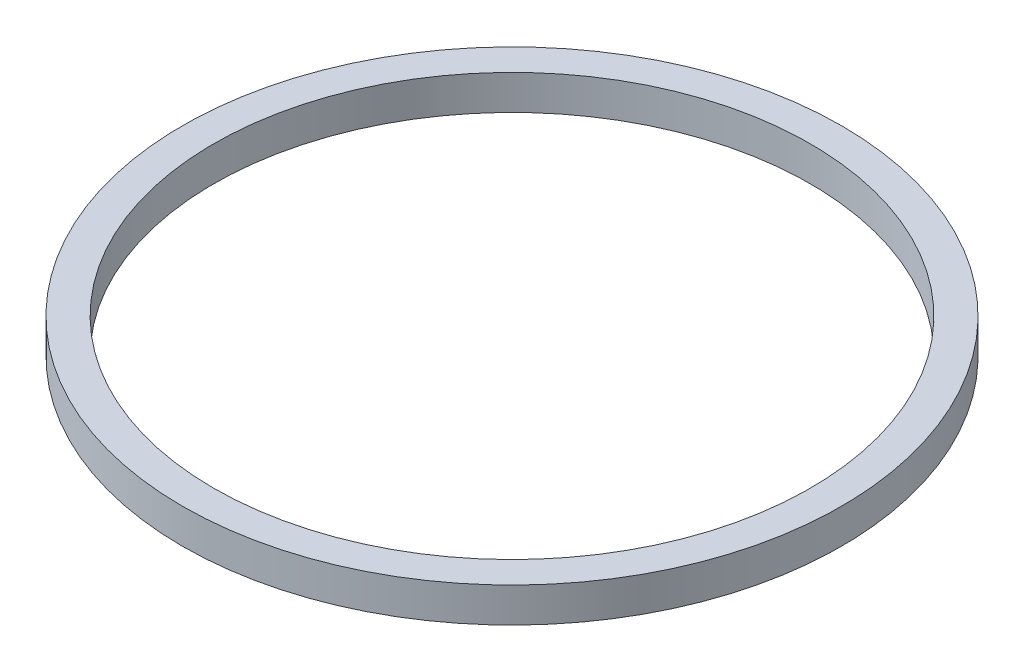
ISO-10303-21;
HEADER;
FILE_DESCRIPTION(('STEP AP214'),'2;1');
FILE_NAME('part.step','',(''),(''),'','','');
FILE_SCHEMA(('AUTOMOTIVE_DESIGN { 1 0 10303 214 1 1 1 1 }'));
ENDSEC;
DATA;
#1=APPLICATION_CONTEXT('core data for automotive mechanical design processes');
#2=APPLICATION_PROTOCOL_DEFINITION('international standard','automotive_design',2000,#1);
#3=PRODUCT_CONTEXT('',#1,'mechanical');
#4=PRODUCT('Part','Part','',(#3));
#5=PRODUCT_RELATED_PRODUCT_CATEGORY('part','',(#4));
#6=PRODUCT_DEFINITION_FORMATION('','',#4);
#7=PRODUCT_DEFINITION_CONTEXT('part definition',#1,'design');
#8=PRODUCT_DEFINITION('design','',#6,#7);
#9=PRODUCT_DEFINITION_SHAPE('','',#8);
#10=(LENGTH_UNIT() NAMED_UNIT(*) SI_UNIT(.MILLI.,.METRE.));
#11=(NAMED_UNIT(*) PLANE_ANGLE_UNIT() SI_UNIT($,.RADIAN.));
#12=(NAMED_UNIT(*) SI_UNIT($,.STERADIAN.) SOLID_ANGLE_UNIT());
#13=UNCERTAINTY_MEASURE_WITH_UNIT(LENGTH_MEASURE(1.E-05),#10,'distance_accuracy_value','');
#14=(GEOMETRIC_REPRESENTATION_CONTEXT(3) GLOBAL_UNCERTAINTY_ASSIGNED_CONTEXT((#13)) GLOBAL_UNIT_ASSIGNED_CONTEXT((#10,
#11,#12)) REPRESENTATION_CONTEXT('',''));
#15=CARTESIAN_POINT('',(0.,0.,0.));
#16=DIRECTION('',(0.,0.,1.));
#17=DIRECTION('',(1.,0.,0.));
#18=AXIS2_PLACEMENT_3D('',#15,#16,#17);
#19=CARTESIAN_POINT('',(0.,1.,0.));
#20=DIRECTION('',(0.,1.,0.));
#21=DIRECTION('',(0.,0.,1.));
#22=AXIS2_PLACEMENT_3D('',#19,#20,#21);
#23=PLANE('',#22);
#24=CARTESIAN_POINT('',(0.,1.,0.));
#25=DIRECTION('',(0.,1.,0.));
#26=DIRECTION('',(0.,0.,1.));
#27=AXIS2_PLACEMENT_3D('',#24,#25,#26);
#28=CIRCLE('',#27,9.5);
#29=CARTESIAN_POINT('',(0.,1.,9.5));
#30=VERTEX_POINT('',#29);
#31=EDGE_CURVE('E10',#30,#30,#28,.T.);
#32=ORIENTED_EDGE('',*,*,#31,.T.);
#33=EDGE_LOOP('',(#32));
#34=FACE_BOUND('',#33,.T.);
#35=CARTESIAN_POINT('',(0.,1.,0.));
#36=DIRECTION('',(0.,1.,0.));
#37=DIRECTION('',(0.,0.,1.));
#38=AXIS2_PLACEMENT_3D('',#35,#36,#37);
#39=CIRCLE('',#38,8.6);
#40=CARTESIAN_POINT('',(0.,1.,8.6));
#41=VERTEX_POINT('',#40);
#42=EDGE_CURVE('E46',#41,#41,#39,.T.);
#43=ORIENTED_EDGE('',*,*,#42,.F.);
#44=EDGE_LOOP('',(#43));
#45=FACE_BOUND('',#44,.T.);
#46=ADVANCED_FACE('F35',(#34,#45),#23,.T.);
#47=CARTESIAN_POINT('',(0.,0.,0.));
#48=DIRECTION('',(0.,1.,0.));
#49=DIRECTION('',(0.,0.,1.));
#50=AXIS2_PLACEMENT_3D('',#47,#48,#49);
#51=PLANE('',#50);
#52=CARTESIAN_POINT('',(0.,0.,0.));
#53=DIRECTION('',(0.,1.,0.));
#54=DIRECTION('',(0.,0.,1.));
#55=AXIS2_PLACEMENT_3D('',#52,#53,#54);
#56=CIRCLE('',#55,9.5);
#57=CARTESIAN_POINT('',(0.,0.,9.5));
#58=VERTEX_POINT('',#57);
#59=EDGE_CURVE('E39',#58,#58,#56,.T.);
#60=ORIENTED_EDGE('',*,*,#59,.F.);
#61=EDGE_LOOP('',(#60));
#62=FACE_BOUND('',#61,.T.);
#63=CARTESIAN_POINT('',(0.,0.,0.));
#64=DIRECTION('',(0.,1.,0.));
#65=DIRECTION('',(0.,0.,1.));
#66=AXIS2_PLACEMENT_3D('',#63,#64,#65);
#67=CIRCLE('',#66,8.6);
#68=CARTESIAN_POINT('',(0.,0.,8.6));
#69=VERTEX_POINT('',#68);
#70=EDGE_CURVE('E48',#69,#69,#67,.T.);
#71=ORIENTED_EDGE('',*,*,#70,.T.);
#72=EDGE_LOOP('',(#71));
#73=FACE_BOUND('',#72,.T.);
#74=ADVANCED_FACE('F58',(#62,#73),#51,.F.);
#75=CARTESIAN_POINT('',(0.,1.,0.));
#76=DIRECTION('',(0.,-1.,0.));
#77=DIRECTION('',(0.,0.,-1.));
#78=AXIS2_PLACEMENT_3D('',#75,#76,#77);
#79=CYLINDRICAL_SURFACE('',#78,9.5);
#80=ORIENTED_EDGE('',*,*,#31,.F.);
#81=EDGE_LOOP('',(#80));
#82=FACE_BOUND('',#81,.T.);
#83=ORIENTED_EDGE('',*,*,#59,.T.);
#84=EDGE_LOOP('',(#83));
#85=FACE_BOUND('',#84,.T.);
#86=ADVANCED_FACE('F37',(#82,#85),#79,.T.);
#87=CARTESIAN_POINT('',(0.,1.,0.));
#88=DIRECTION('',(0.,-1.,0.));
#89=DIRECTION('',(0.,0.,-1.));
#90=AXIS2_PLACEMENT_3D('',#87,#88,#89);
#91=CYLINDRICAL_SURFACE('',#90,8.6);
#92=ORIENTED_EDGE('',*,*,#42,.T.);
#93=EDGE_LOOP('',(#92));
#94=FACE_BOUND('',#93,.T.);
#95=ORIENTED_EDGE('',*,*,#70,.F.);
#96=EDGE_LOOP('',(#95));
#97=FACE_BOUND('',#96,.T.);
#98=ADVANCED_FACE('F54',(#94,#97),#91,.F.);
#99=CLOSED_SHELL('',(#46,#74,#86,#98));
#100=MANIFOLD_SOLID_BREP('B2',#99);
#101=ADVANCED_BREP_SHAPE_REPRESENTATION('',(#18,#100),#14);
#102=SHAPE_DEFINITION_REPRESENTATION(#9,#101);
ENDSEC;
END-ISO-10303-21;
